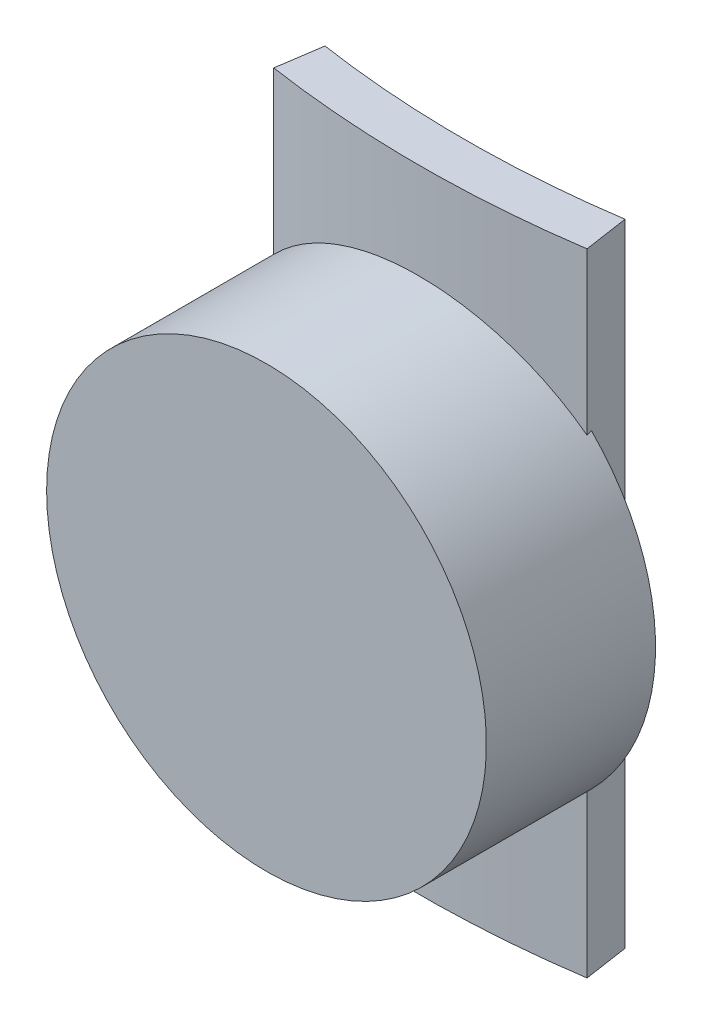
ISO-10303-21;
HEADER;
FILE_DESCRIPTION(('STEP AP214'),'2;1');
FILE_NAME('part.step','',(''),(''),'','','');
FILE_SCHEMA(('AUTOMOTIVE_DESIGN { 1 0 10303 214 1 1 1 1 }'));
ENDSEC;
DATA;
#1=APPLICATION_CONTEXT('core data for automotive mechanical design processes');
#2=APPLICATION_PROTOCOL_DEFINITION('international standard','automotive_design',2000,#1);
#3=PRODUCT_CONTEXT('',#1,'mechanical');
#4=PRODUCT('Part','Part','',(#3));
#5=PRODUCT_RELATED_PRODUCT_CATEGORY('part','',(#4));
#6=PRODUCT_DEFINITION_FORMATION('','',#4);
#7=PRODUCT_DEFINITION_CONTEXT('part definition',#1,'design');
#8=PRODUCT_DEFINITION('design','',#6,#7);
#9=PRODUCT_DEFINITION_SHAPE('','',#8);
#10=(LENGTH_UNIT() NAMED_UNIT(*) SI_UNIT(.MILLI.,.METRE.));
#11=(NAMED_UNIT(*) PLANE_ANGLE_UNIT() SI_UNIT($,.RADIAN.));
#12=(NAMED_UNIT(*) SI_UNIT($,.STERADIAN.) SOLID_ANGLE_UNIT());
#13=UNCERTAINTY_MEASURE_WITH_UNIT(LENGTH_MEASURE(1.E-05),#10,'distance_accuracy_value','');
#14=(GEOMETRIC_REPRESENTATION_CONTEXT(3) GLOBAL_UNCERTAINTY_ASSIGNED_CONTEXT((#13)) GLOBAL_UNIT_ASSIGNED_CONTEXT((#10,
#11,#12)) REPRESENTATION_CONTEXT('',''));
#15=CARTESIAN_POINT('',(0.,0.,0.));
#16=DIRECTION('',(0.,0.,1.));
#17=DIRECTION('',(1.,0.,0.));
#18=AXIS2_PLACEMENT_3D('',#15,#16,#17);
#19=CARTESIAN_POINT('',(0.,20.2,0.));
#20=DIRECTION('',(0.,-1.,0.));
#21=DIRECTION('',(0.,0.,-1.));
#22=AXIS2_PLACEMENT_3D('',#19,#20,#21);
#23=CYLINDRICAL_SURFACE('',#22,18.8);
#24=DIRECTION('',(0.,-1.,0.));
#25=VECTOR('',#24,1.);
#26=CARTESIAN_POINT('',(-2.77881692923669,0.,18.593498231204));
#27=LINE('',#26,#25);
#28=CARTESIAN_POINT('',(-2.77881692923669,33.3,18.593498231204));
#29=VERTEX_POINT('',#28);
#30=CARTESIAN_POINT('',(-2.77881692923669,30.4364532654126,18.593498231204));
#31=VERTEX_POINT('',#30);
#32=EDGE_CURVE('E148',#29,#31,#27,.T.);
#33=ORIENTED_EDGE('',*,*,#32,.T.);
#34=CARTESIAN_POINT('',(-3.89999999999999,27.7,18.3910304224641));
#35=CARTESIAN_POINT('',(-3.8999922007657,27.9165206479656,18.3910347713573));
#36=CARTESIAN_POINT('',(-3.88190749788575,28.1331377509313,18.394895724896));
#37=CARTESIAN_POINT('',(-3.81011408327714,28.5602315255363,18.4098974944324));
#38=CARTESIAN_POINT('',(-3.75637793482257,28.7707033375262,18.4210439171011));
#39=CARTESIAN_POINT('',(-3.61503004672811,29.1792661590614,18.4493011375102));
#40=CARTESIAN_POINT('',(-3.52745334358663,29.3773697283471,18.4664057646812));
#41=CARTESIAN_POINT('',(-3.32100799968069,29.7560706727699,18.5046447646243));
#42=CARTESIAN_POINT('',(-3.20214067553666,29.9366687840494,18.525778967833));
#43=CARTESIAN_POINT('',(-2.9345616491014,30.2779852141244,18.5700548493708));
#44=CARTESIAN_POINT('',(-2.78546479620306,30.4383985965432,18.5932199877898));
#45=CARTESIAN_POINT('',(-2.46249091785955,30.7321265809316,18.6387415618761));
#46=CARTESIAN_POINT('',(-2.28861208535718,30.8654392050413,18.6610979384207));
#47=CARTESIAN_POINT('',(-1.91898086670906,31.1023736421384,18.70273703015));
#48=CARTESIAN_POINT('',(-1.72303807213733,31.2057043034167,18.7219888472768));
#49=CARTESIAN_POINT('',(-1.31610484318871,31.3778609912583,18.7549855551788));
#50=CARTESIAN_POINT('',(-1.10511592777876,31.4466904952366,18.76873100092));
#51=CARTESIAN_POINT('',(-0.677246729454955,31.5469379630805,18.7890004691611));
#52=CARTESIAN_POINT('',(-0.460491988232334,31.578871322026,18.7956238846988));
#53=CARTESIAN_POINT('',(-0.0246073136574549,31.6060293625916,18.8012467120959));
#54=CARTESIAN_POINT('',(0.194522371865755,31.6012578382848,18.8002469119442));
#55=CARTESIAN_POINT('',(0.625390674440004,31.5555297355669,18.790812566589));
#56=CARTESIAN_POINT('',(0.837191089167289,31.515128459004,18.7824921207727));
#57=CARTESIAN_POINT('',(1.25093917675391,31.4001700708695,18.759480549831));
#58=CARTESIAN_POINT('',(1.45288643435901,31.3256115211375,18.744789156464));
#59=CARTESIAN_POINT('',(1.84276327282634,31.1439496489214,18.7105001262658));
#60=CARTESIAN_POINT('',(2.03058981453584,31.0366315190752,18.6908702615267));
#61=CARTESIAN_POINT('',(2.3857727815481,30.7926562659691,18.6488638221951));
#62=CARTESIAN_POINT('',(2.55312667829787,30.655995524368,18.6264869090001));
#63=CARTESIAN_POINT('',(2.86591215679809,30.354176858298,18.5809589640557));
#64=CARTESIAN_POINT('',(3.01087417173623,30.188532915039,18.5578012837503));
#65=CARTESIAN_POINT('',(3.27104298930778,29.8350497631211,18.5137176601573));
#66=CARTESIAN_POINT('',(3.3862491403923,29.6472100685845,18.4927917657438));
#67=CARTESIAN_POINT('',(3.58381582445805,29.253960397218,18.455526121421));
#68=CARTESIAN_POINT('',(3.66609543315043,29.0485086198221,18.4391976996329));
#69=CARTESIAN_POINT('',(3.79482581924254,28.6262779789741,18.4131381038513));
#70=CARTESIAN_POINT('',(3.8412816546753,28.4095007192071,18.4034059985336));
#71=CARTESIAN_POINT('',(3.89633374268451,27.9750419775019,18.3918288547712));
#72=CARTESIAN_POINT('',(3.90561026741745,27.7574503740634,18.389842117508));
#73=CARTESIAN_POINT('',(3.88787530512301,27.3238293234074,18.3935995734337));
#74=CARTESIAN_POINT('',(3.86086604280415,27.1077997812351,18.3993432926625));
#75=CARTESIAN_POINT('',(3.77191414955457,26.6857533828578,18.4177813574467));
#76=CARTESIAN_POINT('',(3.71033932322322,26.4796555158122,18.430402481283));
#77=CARTESIAN_POINT('',(3.55439937481537,26.0807016103297,18.4611083538776));
#78=CARTESIAN_POINT('',(3.46003137897675,25.8878467341894,18.4791935814533));
#79=CARTESIAN_POINT('',(3.23965995066737,25.5178892504578,18.5191055307356));
#80=CARTESIAN_POINT('',(3.11323341244944,25.3410440304795,18.540980944227));
#81=CARTESIAN_POINT('',(2.8328936384275,25.0108302681341,18.5858768961744));
#82=CARTESIAN_POINT('',(2.67897734823101,24.8574643380764,18.6088975616745));
#83=CARTESIAN_POINT('',(2.34496376804581,24.5759597330256,18.6539528597807));
#84=CARTESIAN_POINT('',(2.16447399349518,24.4482825138512,18.6759647563089));
#85=CARTESIAN_POINT('',(1.78421190999541,24.2250630698536,18.7161183583482));
#86=CARTESIAN_POINT('',(1.58444044916871,24.1295194324339,18.7342602339731));
#87=CARTESIAN_POINT('',(1.17246045946488,23.973940344347,18.7645330720474));
#88=CARTESIAN_POINT('',(0.960334381268427,23.9136938107932,18.7766996952623));
#89=CARTESIAN_POINT('',(0.528693928642673,23.8297537864651,18.7938046227131));
#90=CARTESIAN_POINT('',(0.309180518822316,23.8060555421358,18.7987438669545));
#91=CARTESIAN_POINT('',(-0.126606379574521,23.796080433891,18.8008130854979));
#92=CARTESIAN_POINT('',(-0.342863640744838,23.8091116929888,18.7980874461252));
#93=CARTESIAN_POINT('',(-0.770034749785318,23.8706903061563,18.7854389607183));
#94=CARTESIAN_POINT('',(-0.980948675537033,23.9192371422618,18.7755162196479));
#95=CARTESIAN_POINT('',(-1.39097445226212,24.0501517825754,18.7495951160909));
#96=CARTESIAN_POINT('',(-1.59011578947723,24.1324306024528,18.733612747066));
#97=CARTESIAN_POINT('',(-1.97186307971024,24.3283830952956,18.6972876770021));
#98=CARTESIAN_POINT('',(-2.15446760531675,24.4420594749875,18.6769446000683));
#99=CARTESIAN_POINT('',(-2.5013612426708,24.6998840064681,18.6336875051503));
#100=CARTESIAN_POINT('',(-2.66528011333898,24.8445239315934,18.6107351945086));
#101=CARTESIAN_POINT('',(-2.96675692372845,25.159166327911,18.5650655210299));
#102=CARTESIAN_POINT('',(-3.10430857379523,25.329174833384,18.5423482154707));
#103=CARTESIAN_POINT('',(-3.35069165357651,25.6921291538454,18.4994251663438));
#104=CARTESIAN_POINT('',(-3.45916640025504,25.8853211465916,18.4792520919328));
#105=CARTESIAN_POINT('',(-3.64193974146513,26.2875606828583,18.4441048983603));
#106=CARTESIAN_POINT('',(-3.71626854030752,26.4965940222291,18.4291261873332));
#107=CARTESIAN_POINT('',(-3.81466672069389,26.8716693774127,18.4089688288647));
#108=CARTESIAN_POINT('',(-3.84660787736984,27.0356108847697,18.4022847454184));
#109=CARTESIAN_POINT('',(-3.88927710207697,27.3663492438033,18.3933139536315));
#110=CARTESIAN_POINT('',(-3.90000601020543,27.5331459821365,18.3910270711426));
#111=CARTESIAN_POINT('',(-3.89999999999999,27.7,18.3910304224641));
#112=B_SPLINE_CURVE_WITH_KNOTS('',3,(#34,#35,#36,#37,#38,#39,#40,#41,#42,#43,#44,#45,#46,#47,
#48,#49,#50,#51,#52,#53,#54,#55,#56,#57,#58,#59,#60,#61,#62,#63,#64,#65,#66,#67,#68,#69,#70,#71,
#72,#73,#74,#75,#76,#77,#78,#79,#80,#81,#82,#83,#84,#85,#86,#87,#88,#89,#90,#91,#92,#93,#94,#95,
#96,#97,#98,#99,#100,#101,#102,#103,#104,#105,#106,#107,#108,#109,#110,#111),.UNSPECIFIED.,.T.,
.F.,(4,2,2,2,2,2,2,2,2,2,2,2,2,2,2,2,2,2,2,2,2,2,2,2,2,2,2,2,2,2,2,2,2,2,2,2,2,2,4),(0.,
0.648950795545121,1.29840159242729,1.94718178044097,2.59593467399,3.2535411544063,
3.91119561085589,4.57503770926139,5.23881288472942,5.89319932863505,6.54751813149763,
7.19181588723822,7.83614077303223,8.48478476628309,9.13350879210084,9.79438921626242,
10.4552841101571,11.1177934686926,11.7802092690184,12.4304479074804,13.0806466811484,
13.7240545149785,14.3675187467583,15.0199627580436,15.6724793076785,16.3358367107343,
16.9991649486997,17.6584847720892,18.3177188355829,18.964618289371,19.6115083088732,
20.2567027143228,20.9019527581751,21.5583324197859,22.2148684603299,22.8791235193356,
23.5427898647763,24.0429007653592,24.5429918589793),.UNSPECIFIED.);
#113=CARTESIAN_POINT('',(2.77881692923669,30.4364532654126,18.593498231204));
#114=VERTEX_POINT('',#113);
#115=EDGE_CURVE('E105',#31,#114,#112,.T.);
#116=ORIENTED_EDGE('',*,*,#115,.T.);
#117=DIRECTION('',(0.,-1.,0.));
#118=VECTOR('',#117,1.);
#119=CARTESIAN_POINT('',(2.77881692923669,0.,18.593498231204));
#120=LINE('',#119,#118);
#121=CARTESIAN_POINT('',(2.77881692923669,33.3,18.593498231204));
#122=VERTEX_POINT('',#121);
#123=EDGE_CURVE('E136',#122,#114,#120,.T.);
#124=ORIENTED_EDGE('',*,*,#123,.F.);
#125=CARTESIAN_POINT('',(0.,33.3,0.));
#126=DIRECTION('',(0.,-1.,0.));
#127=DIRECTION('',(0.,0.,-1.));
#128=AXIS2_PLACEMENT_3D('',#125,#126,#127);
#129=CIRCLE('',#128,18.8);
#130=EDGE_CURVE('E62',#122,#29,#129,.T.);
#131=ORIENTED_EDGE('',*,*,#130,.T.);
#132=EDGE_LOOP('',(#33,#116,#124,#131));
#133=FACE_BOUND('',#132,.T.);
#134=ADVANCED_FACE('F38',(#133),#23,.T.);
#135=CARTESIAN_POINT('',(2.77881692923669,24.9635467345874,18.593498231204));
#136=VERTEX_POINT('',#135);
#137=CARTESIAN_POINT('',(2.77881692923669,22.1,18.593498231204));
#138=VERTEX_POINT('',#137);
#139=EDGE_CURVE('E139',#136,#138,#120,.T.);
#140=ORIENTED_EDGE('',*,*,#139,.F.);
#141=CARTESIAN_POINT('',(-2.77881692923669,24.9635467345874,18.593498231204));
#142=VERTEX_POINT('',#141);
#143=EDGE_CURVE('E156',#136,#142,#112,.T.);
#144=ORIENTED_EDGE('',*,*,#143,.T.);
#145=CARTESIAN_POINT('',(-2.77881692923669,22.1,18.593498231204));
#146=VERTEX_POINT('',#145);
#147=EDGE_CURVE('E150',#142,#146,#27,.T.);
#148=ORIENTED_EDGE('',*,*,#147,.T.);
#149=CARTESIAN_POINT('',(0.,22.1,0.));
#150=DIRECTION('',(0.,-1.,0.));
#151=DIRECTION('',(0.,0.,-1.));
#152=AXIS2_PLACEMENT_3D('',#149,#150,#151);
#153=CIRCLE('',#152,18.8);
#154=EDGE_CURVE('E118',#138,#146,#153,.T.);
#155=ORIENTED_EDGE('',*,*,#154,.F.);
#156=EDGE_LOOP('',(#140,#144,#148,#155));
#157=FACE_BOUND('',#156,.T.);
#158=ADVANCED_FACE('F164',(#157),#23,.T.);
#159=CARTESIAN_POINT('',(0.,22.1,0.));
#160=DIRECTION('',(0.,1.,0.));
#161=DIRECTION('',(0.,0.,1.));
#162=AXIS2_PLACEMENT_3D('',#159,#160,#161);
#163=PLANE('',#162);
#164=CARTESIAN_POINT('',(0.,22.1,0.));
#165=DIRECTION('',(0.,-1.,0.));
#166=DIRECTION('',(0.,0.,-1.));
#167=AXIS2_PLACEMENT_3D('',#164,#165,#166);
#168=CIRCLE('',#167,18.);
#169=CARTESIAN_POINT('',(2.660569400333,22.1,17.8022855405145));
#170=VERTEX_POINT('',#169);
#171=CARTESIAN_POINT('',(-2.660569400333,22.1,17.8022855405145));
#172=VERTEX_POINT('',#171);
#173=EDGE_CURVE('E120',#170,#172,#168,.T.);
#174=ORIENTED_EDGE('',*,*,#173,.F.);
#175=DIRECTION('',(-0.147809411129611,0.,-0.989015863361917));
#176=VECTOR('',#175,1.);
#177=CARTESIAN_POINT('',(0.,22.0999999999999,0.));
#178=LINE('',#177,#176);
#179=EDGE_CURVE('E133',#138,#170,#178,.T.);
#180=ORIENTED_EDGE('',*,*,#179,.F.);
#181=ORIENTED_EDGE('',*,*,#154,.T.);
#182=DIRECTION('',(0.147809411129611,0.,-0.989015863361917));
#183=VECTOR('',#182,1.);
#184=CARTESIAN_POINT('',(0.,22.0999999999999,0.));
#185=LINE('',#184,#183);
#186=EDGE_CURVE('E145',#146,#172,#185,.T.);
#187=ORIENTED_EDGE('',*,*,#186,.T.);
#188=EDGE_LOOP('',(#174,#180,#181,#187));
#189=FACE_BOUND('',#188,.T.);
#190=ADVANCED_FACE('F40',(#189),#163,.F.);
#191=CARTESIAN_POINT('',(0.,20.2,0.));
#192=DIRECTION('',(0.,-1.,0.));
#193=DIRECTION('',(0.,0.,-1.));
#194=AXIS2_PLACEMENT_3D('',#191,#192,#193);
#195=CYLINDRICAL_SURFACE('',#194,18.);
#196=CARTESIAN_POINT('',(0.,33.3,0.));
#197=DIRECTION('',(0.,-1.,0.));
#198=DIRECTION('',(0.,0.,-1.));
#199=AXIS2_PLACEMENT_3D('',#196,#197,#198);
#200=CIRCLE('',#199,18.);
#201=CARTESIAN_POINT('',(2.660569400333,33.3,17.8022855405145));
#202=VERTEX_POINT('',#201);
#203=CARTESIAN_POINT('',(-2.660569400333,33.3,17.8022855405145));
#204=VERTEX_POINT('',#203);
#205=EDGE_CURVE('E124',#202,#204,#200,.T.);
#206=ORIENTED_EDGE('',*,*,#205,.F.);
#207=DIRECTION('',(0.,-1.,0.));
#208=VECTOR('',#207,1.);
#209=CARTESIAN_POINT('',(2.660569400333,0.,17.8022855405145));
#210=LINE('',#209,#208);
#211=EDGE_CURVE('E130',#202,#170,#210,.T.);
#212=ORIENTED_EDGE('',*,*,#211,.T.);
#213=ORIENTED_EDGE('',*,*,#173,.T.);
#214=DIRECTION('',(0.,-1.,0.));
#215=VECTOR('',#214,1.);
#216=CARTESIAN_POINT('',(-2.660569400333,0.,17.8022855405145));
#217=LINE('',#216,#215);
#218=EDGE_CURVE('E142',#204,#172,#217,.T.);
#219=ORIENTED_EDGE('',*,*,#218,.F.);
#220=EDGE_LOOP('',(#206,#212,#213,#219));
#221=FACE_BOUND('',#220,.T.);
#222=ADVANCED_FACE('F186',(#221),#195,.F.);
#223=CARTESIAN_POINT('',(0.,33.3,0.));
#224=DIRECTION('',(0.,-1.,0.));
#225=DIRECTION('',(0.,0.,-1.));
#226=AXIS2_PLACEMENT_3D('',#223,#224,#225);
#227=PLANE('',#226);
#228=DIRECTION('',(0.147809411129611,0.,0.989015863361917));
#229=VECTOR('',#228,1.);
#230=CARTESIAN_POINT('',(0.,33.3,0.));
#231=LINE('',#230,#229);
#232=EDGE_CURVE('E127',#202,#122,#231,.T.);
#233=ORIENTED_EDGE('',*,*,#232,.F.);
#234=ORIENTED_EDGE('',*,*,#205,.T.);
#235=DIRECTION('',(-0.147809411129611,0.,0.989015863361917));
#236=VECTOR('',#235,1.);
#237=CARTESIAN_POINT('',(0.,33.3,0.));
#238=LINE('',#237,#236);
#239=EDGE_CURVE('E140',#204,#29,#238,.T.);
#240=ORIENTED_EDGE('',*,*,#239,.T.);
#241=ORIENTED_EDGE('',*,*,#130,.F.);
#242=EDGE_LOOP('',(#233,#234,#240,#241));
#243=FACE_BOUND('',#242,.T.);
#244=ADVANCED_FACE('F181',(#243),#227,.F.);
#245=CARTESIAN_POINT('',(0.,0.,0.));
#246=DIRECTION('',(0.989015863361917,0.,-0.147809411129611));
#247=DIRECTION('',(-0.147809411129611,0.,-0.989015863361917));
#248=AXIS2_PLACEMENT_3D('',#245,#246,#247);
#249=PLANE('',#248);
#250=CARTESIAN_POINT('',(0.,27.7,0.));
#251=DIRECTION('',(0.989015863361917,0.,-0.147809411129611));
#252=DIRECTION('',(-0.147809411129611,0.,-0.989015863361917));
#253=AXIS2_PLACEMENT_3D('',#250,#251,#252);
#254=ELLIPSE('',#253,26.3853293927283,3.89999999999999);
#255=CARTESIAN_POINT('',(2.76484352495887,30.4505709011936,18.5));
#256=VERTEX_POINT('',#255);
#257=EDGE_CURVE('E153',#256,#114,#254,.T.);
#258=ORIENTED_EDGE('',*,*,#257,.F.);
#259=DIRECTION('',(0.,1.,0.));
#260=VECTOR('',#259,1.);
#261=CARTESIAN_POINT('',(2.76484352495887,0.,18.5));
#262=LINE('',#261,#260);
#263=CARTESIAN_POINT('',(2.76484352495887,24.9494290988064,18.5));
#264=VERTEX_POINT('',#263);
#265=EDGE_CURVE('E151',#264,#256,#262,.T.);
#266=ORIENTED_EDGE('',*,*,#265,.F.);
#267=EDGE_CURVE('E154',#136,#264,#254,.T.);
#268=ORIENTED_EDGE('',*,*,#267,.F.);
#269=ORIENTED_EDGE('',*,*,#139,.T.);
#270=ORIENTED_EDGE('',*,*,#179,.T.);
#271=ORIENTED_EDGE('',*,*,#211,.F.);
#272=ORIENTED_EDGE('',*,*,#232,.T.);
#273=ORIENTED_EDGE('',*,*,#123,.T.);
#274=EDGE_LOOP('',(#258,#266,#268,#269,#270,#271,#272,#273));
#275=FACE_BOUND('',#274,.T.);
#276=ADVANCED_FACE('F179',(#275),#249,.T.);
#277=CARTESIAN_POINT('',(0.,0.,0.));
#278=DIRECTION('',(0.989015863361917,0.,0.147809411129611));
#279=DIRECTION('',(0.147809411129611,0.,-0.989015863361917));
#280=AXIS2_PLACEMENT_3D('',#277,#278,#279);
#281=PLANE('',#280);
#282=DIRECTION('',(0.,1.,0.));
#283=VECTOR('',#282,1.);
#284=CARTESIAN_POINT('',(-2.76484352495887,0.,18.5));
#285=LINE('',#284,#283);
#286=CARTESIAN_POINT('',(-2.76484352495887,24.9494290988064,18.5));
#287=VERTEX_POINT('',#286);
#288=CARTESIAN_POINT('',(-2.76484352495887,30.4505709011936,18.5));
#289=VERTEX_POINT('',#288);
#290=EDGE_CURVE('E42',#287,#289,#285,.T.);
#291=ORIENTED_EDGE('',*,*,#290,.T.);
#292=CARTESIAN_POINT('',(0.,27.7,0.));
#293=DIRECTION('',(0.989015863361917,0.,0.147809411129611));
#294=DIRECTION('',(0.147809411129611,0.,-0.989015863361917));
#295=AXIS2_PLACEMENT_3D('',#292,#293,#294);
#296=ELLIPSE('',#295,26.3853293927283,3.89999999999999);
#297=EDGE_CURVE('E11',#289,#31,#296,.T.);
#298=ORIENTED_EDGE('',*,*,#297,.T.);
#299=ORIENTED_EDGE('',*,*,#32,.F.);
#300=ORIENTED_EDGE('',*,*,#239,.F.);
#301=ORIENTED_EDGE('',*,*,#218,.T.);
#302=ORIENTED_EDGE('',*,*,#186,.F.);
#303=ORIENTED_EDGE('',*,*,#147,.F.);
#304=EDGE_CURVE('E47',#142,#287,#296,.T.);
#305=ORIENTED_EDGE('',*,*,#304,.T.);
#306=EDGE_LOOP('',(#291,#298,#299,#300,#301,#302,#303,#305));
#307=FACE_BOUND('',#306,.T.);
#308=ADVANCED_FACE('F116',(#307),#281,.F.);
#309=CARTESIAN_POINT('',(0.,27.7,18.5));
#310=DIRECTION('',(0.,0.,-1.));
#311=DIRECTION('',(-1.,0.,0.));
#312=AXIS2_PLACEMENT_3D('',#309,#310,#311);
#313=PLANE('',#312);
#314=ORIENTED_EDGE('',*,*,#290,.F.);
#315=CARTESIAN_POINT('',(0.,27.7,18.5));
#316=DIRECTION('',(0.,0.,-1.));
#317=DIRECTION('',(-1.,0.,0.));
#318=AXIS2_PLACEMENT_3D('',#315,#316,#317);
#319=CIRCLE('',#318,3.89999999999999);
#320=EDGE_CURVE('E54',#287,#289,#319,.T.);
#321=ORIENTED_EDGE('',*,*,#320,.T.);
#322=EDGE_LOOP('',(#314,#321));
#323=FACE_BOUND('',#322,.T.);
#324=ADVANCED_FACE('F111',(#323),#313,.T.);
#325=EDGE_CURVE('E113',#256,#264,#319,.T.);
#326=ORIENTED_EDGE('',*,*,#325,.T.);
#327=ORIENTED_EDGE('',*,*,#265,.T.);
#328=EDGE_LOOP('',(#326,#327));
#329=FACE_BOUND('',#328,.T.);
#330=ADVANCED_FACE('F173',(#329),#313,.T.);
#331=CARTESIAN_POINT('',(0.,27.7,15.7726591720295));
#332=DIRECTION('',(0.,0.,-1.));
#333=DIRECTION('',(-1.,0.,0.));
#334=AXIS2_PLACEMENT_3D('',#331,#332,#333);
#335=CYLINDRICAL_SURFACE('',#334,3.89999999999999);
#336=CARTESIAN_POINT('',(0.,27.7,21.5));
#337=DIRECTION('',(0.,0.,-1.));
#338=DIRECTION('',(-1.,0.,0.));
#339=AXIS2_PLACEMENT_3D('',#336,#337,#338);
#340=CIRCLE('',#339,3.89999999999999);
#341=CARTESIAN_POINT('',(-3.89999999999999,27.7,21.5));
#342=VERTEX_POINT('',#341);
#343=EDGE_CURVE('E114',#342,#342,#340,.T.);
#344=ORIENTED_EDGE('',*,*,#343,.T.);
#345=EDGE_LOOP('',(#344));
#346=FACE_BOUND('',#345,.T.);
#347=ORIENTED_EDGE('',*,*,#325,.F.);
#348=ORIENTED_EDGE('',*,*,#257,.T.);
#349=ORIENTED_EDGE('',*,*,#115,.F.);
#350=ORIENTED_EDGE('',*,*,#297,.F.);
#351=ORIENTED_EDGE('',*,*,#320,.F.);
#352=ORIENTED_EDGE('',*,*,#304,.F.);
#353=ORIENTED_EDGE('',*,*,#143,.F.);
#354=ORIENTED_EDGE('',*,*,#267,.T.);
#355=EDGE_LOOP('',(#347,#348,#349,#350,#351,#352,#353,#354));
#356=FACE_BOUND('',#355,.T.);
#357=ADVANCED_FACE('F103',(#346,#356),#335,.T.);
#358=CARTESIAN_POINT('',(0.,27.7,21.5));
#359=DIRECTION('',(0.,0.,1.));
#360=DIRECTION('',(1.,0.,0.));
#361=AXIS2_PLACEMENT_3D('',#358,#359,#360);
#362=PLANE('',#361);
#363=ORIENTED_EDGE('',*,*,#343,.F.);
#364=EDGE_LOOP('',(#363));
#365=FACE_BOUND('',#364,.T.);
#366=ADVANCED_FACE('F172',(#365),#362,.T.);
#367=CLOSED_SHELL('',(#134,#158,#190,#222,#244,#276,#308,#324,#330,#357,#366));
#368=MANIFOLD_SOLID_BREP('B2',#367);
#369=ADVANCED_BREP_SHAPE_REPRESENTATION('',(#18,#368),#14);
#370=SHAPE_DEFINITION_REPRESENTATION(#9,#369);
ENDSEC;
END-ISO-10303-21;
